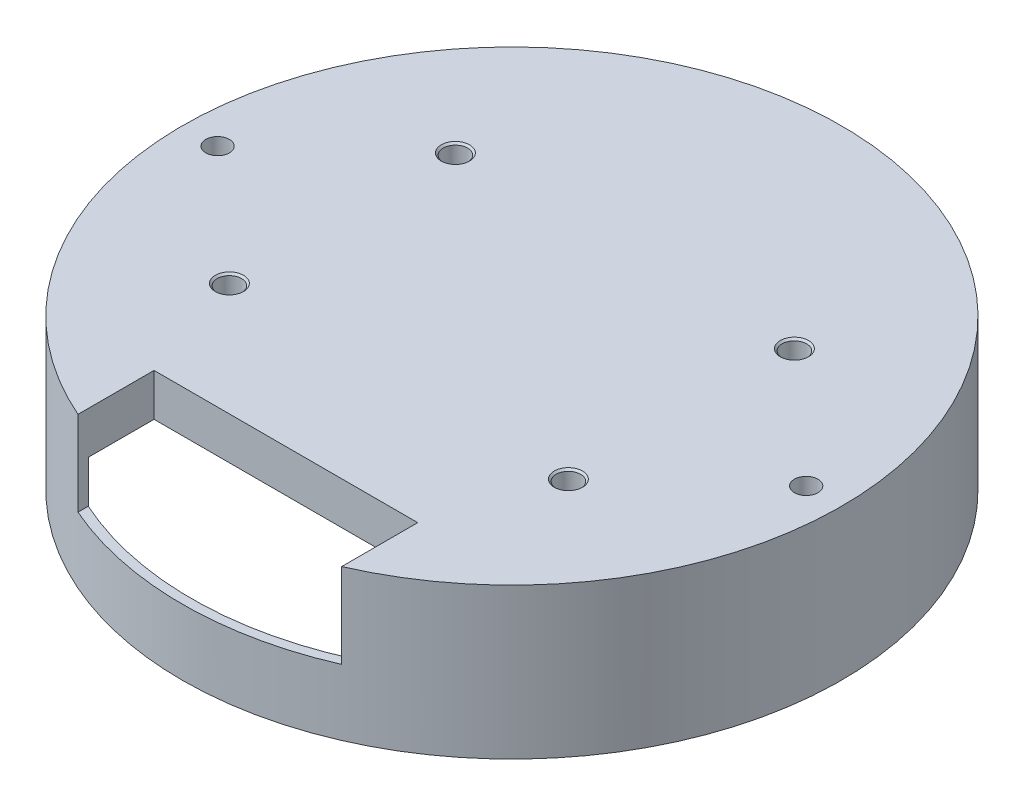
ISO-10303-21;
HEADER;
FILE_DESCRIPTION(('STEP AP214'),'2;1');
FILE_NAME('part.step','',(''),(''),'','','');
FILE_SCHEMA(('AUTOMOTIVE_DESIGN { 1 0 10303 214 1 1 1 1 }'));
ENDSEC;
DATA;
#1=APPLICATION_CONTEXT('core data for automotive mechanical design processes');
#2=APPLICATION_PROTOCOL_DEFINITION('international standard','automotive_design',2000,#1);
#3=PRODUCT_CONTEXT('',#1,'mechanical');
#4=PRODUCT('Part','Part','',(#3));
#5=PRODUCT_RELATED_PRODUCT_CATEGORY('part','',(#4));
#6=PRODUCT_DEFINITION_FORMATION('','',#4);
#7=PRODUCT_DEFINITION_CONTEXT('part definition',#1,'design');
#8=PRODUCT_DEFINITION('design','',#6,#7);
#9=PRODUCT_DEFINITION_SHAPE('','',#8);
#10=(LENGTH_UNIT() NAMED_UNIT(*) SI_UNIT(.MILLI.,.METRE.));
#11=(NAMED_UNIT(*) PLANE_ANGLE_UNIT() SI_UNIT($,.RADIAN.));
#12=(NAMED_UNIT(*) SI_UNIT($,.STERADIAN.) SOLID_ANGLE_UNIT());
#13=UNCERTAINTY_MEASURE_WITH_UNIT(LENGTH_MEASURE(1.E-05),#10,'distance_accuracy_value','');
#14=(GEOMETRIC_REPRESENTATION_CONTEXT(3) GLOBAL_UNCERTAINTY_ASSIGNED_CONTEXT((#13)) GLOBAL_UNIT_ASSIGNED_CONTEXT((#10,
#11,#12)) REPRESENTATION_CONTEXT('',''));
#15=CARTESIAN_POINT('',(0.,0.,0.));
#16=DIRECTION('',(0.,0.,1.));
#17=DIRECTION('',(1.,0.,0.));
#18=AXIS2_PLACEMENT_3D('',#15,#16,#17);
#19=CARTESIAN_POINT('',(0.,16.,0.));
#20=DIRECTION('',(0.,-1.,0.));
#21=DIRECTION('',(0.,0.,-1.));
#22=AXIS2_PLACEMENT_3D('',#19,#20,#21);
#23=CYLINDRICAL_SURFACE('',#22,35.);
#24=CARTESIAN_POINT('',(0.,7.,0.));
#25=DIRECTION('',(0.,1.,0.));
#26=DIRECTION('',(0.,0.,1.));
#27=AXIS2_PLACEMENT_3D('',#24,#25,#26);
#28=CIRCLE('',#27,35.);
#29=CARTESIAN_POINT('',(-14.,7.,32.0780298646909));
#30=VERTEX_POINT('',#29);
#31=CARTESIAN_POINT('',(14.,7.,32.0780298646909));
#32=VERTEX_POINT('',#31);
#33=EDGE_CURVE('E96',#30,#32,#28,.T.);
#34=ORIENTED_EDGE('',*,*,#33,.F.);
#35=DIRECTION('',(0.,1.,0.));
#36=VECTOR('',#35,1.);
#37=CARTESIAN_POINT('',(-14.,7.,32.0780298646909));
#38=LINE('',#37,#36);
#39=CARTESIAN_POINT('',(-14.,16.,32.0780298646909));
#40=VERTEX_POINT('',#39);
#41=EDGE_CURVE('E104',#30,#40,#38,.T.);
#42=ORIENTED_EDGE('',*,*,#41,.T.);
#43=CARTESIAN_POINT('',(0.,16.,0.));
#44=DIRECTION('',(0.,1.,0.));
#45=DIRECTION('',(0.,0.,1.));
#46=AXIS2_PLACEMENT_3D('',#43,#44,#45);
#47=CIRCLE('',#46,35.);
#48=CARTESIAN_POINT('',(14.,16.,32.0780298646909));
#49=VERTEX_POINT('',#48);
#50=EDGE_CURVE('E148',#49,#40,#47,.T.);
#51=ORIENTED_EDGE('',*,*,#50,.F.);
#52=DIRECTION('',(0.,1.,0.));
#53=VECTOR('',#52,1.);
#54=CARTESIAN_POINT('',(14.,7.,32.0780298646909));
#55=LINE('',#54,#53);
#56=EDGE_CURVE('E54',#32,#49,#55,.T.);
#57=ORIENTED_EDGE('',*,*,#56,.F.);
#58=EDGE_LOOP('',(#34,#42,#51,#57));
#59=FACE_BOUND('',#58,.T.);
#60=CARTESIAN_POINT('',(0.,0.,0.));
#61=DIRECTION('',(0.,1.,0.));
#62=DIRECTION('',(0.,0.,1.));
#63=AXIS2_PLACEMENT_3D('',#60,#61,#62);
#64=CIRCLE('',#63,35.);
#65=CARTESIAN_POINT('',(0.,0.,35.));
#66=VERTEX_POINT('',#65);
#67=EDGE_CURVE('E143',#66,#66,#64,.T.);
#68=ORIENTED_EDGE('',*,*,#67,.T.);
#69=EDGE_LOOP('',(#68));
#70=FACE_BOUND('',#69,.T.);
#71=ADVANCED_FACE('F38',(#59,#70),#23,.T.);
#72=CARTESIAN_POINT('',(0.,16.,0.));
#73=DIRECTION('',(0.,1.,0.));
#74=DIRECTION('',(0.,0.,1.));
#75=AXIS2_PLACEMENT_3D('',#72,#73,#74);
#76=PLANE('',#75);
#77=CARTESIAN_POINT('',(18.,16.,12.));
#78=DIRECTION('',(0.,1.,0.));
#79=DIRECTION('',(0.,0.,1.));
#80=AXIS2_PLACEMENT_3D('',#77,#78,#79);
#81=CIRCLE('',#80,1.5);
#82=CARTESIAN_POINT('',(18.,16.,13.5));
#83=VERTEX_POINT('',#82);
#84=EDGE_CURVE('E175',#83,#83,#81,.F.);
#85=ORIENTED_EDGE('',*,*,#84,.T.);
#86=EDGE_LOOP('',(#85));
#87=FACE_BOUND('',#86,.T.);
#88=CARTESIAN_POINT('',(-18.,16.,12.));
#89=DIRECTION('',(0.,1.,0.));
#90=DIRECTION('',(0.,0.,1.));
#91=AXIS2_PLACEMENT_3D('',#88,#89,#90);
#92=CIRCLE('',#91,1.5);
#93=CARTESIAN_POINT('',(-18.,16.,13.5));
#94=VERTEX_POINT('',#93);
#95=EDGE_CURVE('E172',#94,#94,#92,.F.);
#96=ORIENTED_EDGE('',*,*,#95,.T.);
#97=EDGE_LOOP('',(#96));
#98=FACE_BOUND('',#97,.T.);
#99=CARTESIAN_POINT('',(18.,16.,-12.));
#100=DIRECTION('',(0.,1.,0.));
#101=DIRECTION('',(0.,0.,1.));
#102=AXIS2_PLACEMENT_3D('',#99,#100,#101);
#103=CIRCLE('',#102,1.5);
#104=CARTESIAN_POINT('',(18.,16.,-10.5));
#105=VERTEX_POINT('',#104);
#106=EDGE_CURVE('E169',#105,#105,#103,.F.);
#107=ORIENTED_EDGE('',*,*,#106,.T.);
#108=EDGE_LOOP('',(#107));
#109=FACE_BOUND('',#108,.T.);
#110=CARTESIAN_POINT('',(-18.,16.,-12.));
#111=DIRECTION('',(0.,1.,0.));
#112=DIRECTION('',(0.,0.,1.));
#113=AXIS2_PLACEMENT_3D('',#110,#111,#112);
#114=CIRCLE('',#113,1.5);
#115=CARTESIAN_POINT('',(-18.,16.,-10.5));
#116=VERTEX_POINT('',#115);
#117=EDGE_CURVE('E166',#116,#116,#114,.F.);
#118=ORIENTED_EDGE('',*,*,#117,.T.);
#119=EDGE_LOOP('',(#118));
#120=FACE_BOUND('',#119,.T.);
#121=DIRECTION('',(0.,0.,1.));
#122=VECTOR('',#121,1.);
#123=CARTESIAN_POINT('',(-14.,16.,24.));
#124=LINE('',#123,#122);
#125=CARTESIAN_POINT('',(-14.,16.,24.));
#126=VERTEX_POINT('',#125);
#127=EDGE_CURVE('E107',#126,#40,#124,.T.);
#128=ORIENTED_EDGE('',*,*,#127,.F.);
#129=DIRECTION('',(-1.,0.,0.));
#130=VECTOR('',#129,1.);
#131=CARTESIAN_POINT('',(-14.,16.,24.));
#132=LINE('',#131,#130);
#133=CARTESIAN_POINT('',(14.,16.,24.));
#134=VERTEX_POINT('',#133);
#135=EDGE_CURVE('E101',#134,#126,#132,.T.);
#136=ORIENTED_EDGE('',*,*,#135,.F.);
#137=DIRECTION('',(0.,0.,-1.));
#138=VECTOR('',#137,1.);
#139=CARTESIAN_POINT('',(14.,16.,24.));
#140=LINE('',#139,#138);
#141=EDGE_CURVE('E119',#49,#134,#140,.T.);
#142=ORIENTED_EDGE('',*,*,#141,.F.);
#143=ORIENTED_EDGE('',*,*,#50,.T.);
#144=EDGE_LOOP('',(#128,#136,#142,#143));
#145=FACE_BOUND('',#144,.T.);
#146=CARTESIAN_POINT('',(-31.25,16.,0.));
#147=DIRECTION('',(0.,1.,0.));
#148=DIRECTION('',(0.,0.,1.));
#149=AXIS2_PLACEMENT_3D('',#146,#147,#148);
#150=CIRCLE('',#149,1.25);
#151=CARTESIAN_POINT('',(-31.25,16.,1.25));
#152=VERTEX_POINT('',#151);
#153=EDGE_CURVE('E134',#152,#152,#150,.T.);
#154=ORIENTED_EDGE('',*,*,#153,.F.);
#155=EDGE_LOOP('',(#154));
#156=FACE_BOUND('',#155,.T.);
#157=CARTESIAN_POINT('',(31.25,16.,0.));
#158=DIRECTION('',(0.,1.,0.));
#159=DIRECTION('',(0.,0.,1.));
#160=AXIS2_PLACEMENT_3D('',#157,#158,#159);
#161=CIRCLE('',#160,1.25);
#162=CARTESIAN_POINT('',(31.25,16.,1.25));
#163=VERTEX_POINT('',#162);
#164=EDGE_CURVE('E133',#163,#163,#161,.T.);
#165=ORIENTED_EDGE('',*,*,#164,.F.);
#166=EDGE_LOOP('',(#165));
#167=FACE_BOUND('',#166,.T.);
#168=ADVANCED_FACE('F201',(#87,#98,#109,#120,#145,#156,#167),#76,.T.);
#169=CARTESIAN_POINT('',(0.,0.,0.));
#170=DIRECTION('',(0.,1.,0.));
#171=DIRECTION('',(0.,0.,1.));
#172=AXIS2_PLACEMENT_3D('',#169,#170,#171);
#173=PLANE('',#172);
#174=CARTESIAN_POINT('',(0.,0.,0.));
#175=DIRECTION('',(0.,-1.,0.));
#176=DIRECTION('',(0.,0.,-1.));
#177=AXIS2_PLACEMENT_3D('',#174,#175,#176);
#178=CIRCLE('',#177,34.);
#179=CARTESIAN_POINT('',(0.,0.,-34.));
#180=VERTEX_POINT('',#179);
#181=EDGE_CURVE('E144',#180,#180,#178,.T.);
#182=ORIENTED_EDGE('',*,*,#181,.F.);
#183=EDGE_LOOP('',(#182));
#184=FACE_BOUND('',#183,.T.);
#185=ORIENTED_EDGE('',*,*,#67,.F.);
#186=EDGE_LOOP('',(#185));
#187=FACE_BOUND('',#186,.T.);
#188=ADVANCED_FACE('F206',(#184,#187),#173,.F.);
#189=CARTESIAN_POINT('',(0.,11.5,0.));
#190=DIRECTION('',(0.,-1.,0.));
#191=DIRECTION('',(0.,0.,-1.));
#192=AXIS2_PLACEMENT_3D('',#189,#190,#191);
#193=CYLINDRICAL_SURFACE('',#192,34.);
#194=CARTESIAN_POINT('',(0.,11.5,0.));
#195=DIRECTION('',(0.,-1.,0.));
#196=DIRECTION('',(0.,0.,-1.));
#197=AXIS2_PLACEMENT_3D('',#194,#195,#196);
#198=CIRCLE('',#197,34.);
#199=CARTESIAN_POINT('',(-14.,11.5,30.9838667696593));
#200=VERTEX_POINT('',#199);
#201=CARTESIAN_POINT('',(14.,11.5,30.9838667696593));
#202=VERTEX_POINT('',#201);
#203=EDGE_CURVE('E140',#200,#202,#198,.T.);
#204=ORIENTED_EDGE('',*,*,#203,.F.);
#205=DIRECTION('',(0.,-1.,0.));
#206=VECTOR('',#205,1.);
#207=CARTESIAN_POINT('',(-14.,11.5,30.9838667696593));
#208=LINE('',#207,#206);
#209=CARTESIAN_POINT('',(-14.,7.,30.9838667696593));
#210=VERTEX_POINT('',#209);
#211=EDGE_CURVE('E131',#200,#210,#208,.T.);
#212=ORIENTED_EDGE('',*,*,#211,.T.);
#213=CARTESIAN_POINT('',(0.,7.,0.));
#214=DIRECTION('',(0.,1.,0.));
#215=DIRECTION('',(0.,0.,1.));
#216=AXIS2_PLACEMENT_3D('',#213,#214,#215);
#217=CIRCLE('',#216,34.);
#218=CARTESIAN_POINT('',(14.,7.,30.9838667696593));
#219=VERTEX_POINT('',#218);
#220=EDGE_CURVE('E98',#219,#210,#217,.F.);
#221=ORIENTED_EDGE('',*,*,#220,.F.);
#222=DIRECTION('',(0.,-1.,0.));
#223=VECTOR('',#222,1.);
#224=CARTESIAN_POINT('',(14.,11.5,30.9838667696593));
#225=LINE('',#224,#223);
#226=EDGE_CURVE('E126',#219,#202,#225,.F.);
#227=ORIENTED_EDGE('',*,*,#226,.T.);
#228=EDGE_LOOP('',(#204,#212,#221,#227));
#229=FACE_BOUND('',#228,.T.);
#230=ORIENTED_EDGE('',*,*,#181,.T.);
#231=EDGE_LOOP('',(#230));
#232=FACE_BOUND('',#231,.T.);
#233=ADVANCED_FACE('F288',(#229,#232),#193,.F.);
#234=CARTESIAN_POINT('',(0.,11.5,0.));
#235=DIRECTION('',(0.,-1.,0.));
#236=DIRECTION('',(0.,0.,-1.));
#237=AXIS2_PLACEMENT_3D('',#234,#235,#236);
#238=PLANE('',#237);
#239=DIRECTION('',(0.,0.,-1.));
#240=VECTOR('',#239,1.);
#241=CARTESIAN_POINT('',(-14.,11.5,0.));
#242=LINE('',#241,#240);
#243=CARTESIAN_POINT('',(-14.,11.5,24.));
#244=VERTEX_POINT('',#243);
#245=EDGE_CURVE('E160',#200,#244,#242,.T.);
#246=ORIENTED_EDGE('',*,*,#245,.F.);
#247=ORIENTED_EDGE('',*,*,#203,.T.);
#248=DIRECTION('',(0.,0.,1.));
#249=VECTOR('',#248,1.);
#250=CARTESIAN_POINT('',(14.,11.5,0.));
#251=LINE('',#250,#249);
#252=CARTESIAN_POINT('',(14.,11.5,24.));
#253=VERTEX_POINT('',#252);
#254=EDGE_CURVE('E150',#253,#202,#251,.T.);
#255=ORIENTED_EDGE('',*,*,#254,.F.);
#256=DIRECTION('',(1.,0.,0.));
#257=VECTOR('',#256,1.);
#258=CARTESIAN_POINT('',(0.,11.5,24.));
#259=LINE('',#258,#257);
#260=EDGE_CURVE('E158',#244,#253,#259,.T.);
#261=ORIENTED_EDGE('',*,*,#260,.F.);
#262=EDGE_LOOP('',(#246,#247,#255,#261));
#263=FACE_BOUND('',#262,.T.);
#264=CARTESIAN_POINT('',(-31.25,11.5,0.));
#265=DIRECTION('',(0.,-1.,0.));
#266=DIRECTION('',(0.,0.,-1.));
#267=AXIS2_PLACEMENT_3D('',#264,#265,#266);
#268=CIRCLE('',#267,1.25);
#269=CARTESIAN_POINT('',(-31.25,11.5,-1.25));
#270=VERTEX_POINT('',#269);
#271=EDGE_CURVE('E147',#270,#270,#268,.F.);
#272=ORIENTED_EDGE('',*,*,#271,.T.);
#273=EDGE_LOOP('',(#272));
#274=FACE_BOUND('',#273,.T.);
#275=CARTESIAN_POINT('',(31.25,11.5,0.));
#276=DIRECTION('',(0.,-1.,0.));
#277=DIRECTION('',(0.,0.,-1.));
#278=AXIS2_PLACEMENT_3D('',#275,#276,#277);
#279=CIRCLE('',#278,1.25);
#280=CARTESIAN_POINT('',(31.25,11.5,-1.25));
#281=VERTEX_POINT('',#280);
#282=EDGE_CURVE('E137',#281,#281,#279,.F.);
#283=ORIENTED_EDGE('',*,*,#282,.T.);
#284=EDGE_LOOP('',(#283));
#285=FACE_BOUND('',#284,.T.);
#286=ADVANCED_FACE('F284',(#263,#274,#285),#238,.T.);
#287=CARTESIAN_POINT('',(31.25,19.5355339059327,0.));
#288=DIRECTION('',(0.,-1.,0.));
#289=DIRECTION('',(0.,0.,-1.));
#290=AXIS2_PLACEMENT_3D('',#287,#288,#289);
#291=CYLINDRICAL_SURFACE('',#290,1.25);
#292=ORIENTED_EDGE('',*,*,#282,.F.);
#293=EDGE_LOOP('',(#292));
#294=FACE_BOUND('',#293,.T.);
#295=ORIENTED_EDGE('',*,*,#164,.T.);
#296=EDGE_LOOP('',(#295));
#297=FACE_BOUND('',#296,.T.);
#298=ADVANCED_FACE('F280',(#294,#297),#291,.F.);
#299=CARTESIAN_POINT('',(-31.25,19.5355339059327,0.));
#300=DIRECTION('',(0.,-1.,0.));
#301=DIRECTION('',(0.,0.,-1.));
#302=AXIS2_PLACEMENT_3D('',#299,#300,#301);
#303=CYLINDRICAL_SURFACE('',#302,1.25);
#304=ORIENTED_EDGE('',*,*,#271,.F.);
#305=EDGE_LOOP('',(#304));
#306=FACE_BOUND('',#305,.T.);
#307=ORIENTED_EDGE('',*,*,#153,.T.);
#308=EDGE_LOOP('',(#307));
#309=FACE_BOUND('',#308,.T.);
#310=ADVANCED_FACE('F272',(#306,#309),#303,.F.);
#311=CARTESIAN_POINT('',(0.,7.,0.));
#312=DIRECTION('',(0.,1.,0.));
#313=DIRECTION('',(0.,0.,1.));
#314=AXIS2_PLACEMENT_3D('',#311,#312,#313);
#315=PLANE('',#314);
#316=ORIENTED_EDGE('',*,*,#220,.T.);
#317=DIRECTION('',(0.,0.,1.));
#318=VECTOR('',#317,1.);
#319=CARTESIAN_POINT('',(-14.,7.,24.));
#320=LINE('',#319,#318);
#321=EDGE_CURVE('E91',#210,#30,#320,.T.);
#322=ORIENTED_EDGE('',*,*,#321,.T.);
#323=ORIENTED_EDGE('',*,*,#33,.T.);
#324=DIRECTION('',(0.,0.,-1.));
#325=VECTOR('',#324,1.);
#326=CARTESIAN_POINT('',(14.,7.,24.));
#327=LINE('',#326,#325);
#328=EDGE_CURVE('E111',#32,#219,#327,.T.);
#329=ORIENTED_EDGE('',*,*,#328,.T.);
#330=EDGE_LOOP('',(#316,#322,#323,#329));
#331=FACE_BOUND('',#330,.T.);
#332=ADVANCED_FACE('F93',(#331),#315,.T.);
#333=CARTESIAN_POINT('',(-14.,7.,24.));
#334=DIRECTION('',(-1.,0.,0.));
#335=DIRECTION('',(0.,0.,1.));
#336=AXIS2_PLACEMENT_3D('',#333,#334,#335);
#337=PLANE('',#336);
#338=ORIENTED_EDGE('',*,*,#245,.T.);
#339=DIRECTION('',(0.,1.,0.));
#340=VECTOR('',#339,1.);
#341=CARTESIAN_POINT('',(-14.,7.,24.));
#342=LINE('',#341,#340);
#343=EDGE_CURVE('E124',#244,#126,#342,.T.);
#344=ORIENTED_EDGE('',*,*,#343,.T.);
#345=ORIENTED_EDGE('',*,*,#127,.T.);
#346=ORIENTED_EDGE('',*,*,#41,.F.);
#347=ORIENTED_EDGE('',*,*,#321,.F.);
#348=ORIENTED_EDGE('',*,*,#211,.F.);
#349=EDGE_LOOP('',(#338,#344,#345,#346,#347,#348));
#350=FACE_BOUND('',#349,.T.);
#351=ADVANCED_FACE('F105',(#350),#337,.F.);
#352=CARTESIAN_POINT('',(14.,7.,24.));
#353=DIRECTION('',(1.,0.,0.));
#354=DIRECTION('',(0.,0.,-1.));
#355=AXIS2_PLACEMENT_3D('',#352,#353,#354);
#356=PLANE('',#355);
#357=ORIENTED_EDGE('',*,*,#328,.F.);
#358=ORIENTED_EDGE('',*,*,#56,.T.);
#359=ORIENTED_EDGE('',*,*,#141,.T.);
#360=DIRECTION('',(0.,1.,0.));
#361=VECTOR('',#360,1.);
#362=CARTESIAN_POINT('',(14.,7.,24.));
#363=LINE('',#362,#361);
#364=EDGE_CURVE('E60',#253,#134,#363,.T.);
#365=ORIENTED_EDGE('',*,*,#364,.F.);
#366=ORIENTED_EDGE('',*,*,#254,.T.);
#367=ORIENTED_EDGE('',*,*,#226,.F.);
#368=EDGE_LOOP('',(#357,#358,#359,#365,#366,#367));
#369=FACE_BOUND('',#368,.T.);
#370=ADVANCED_FACE('F266',(#369),#356,.F.);
#371=CARTESIAN_POINT('',(-14.,7.,24.));
#372=DIRECTION('',(0.,0.,-1.));
#373=DIRECTION('',(-1.,0.,0.));
#374=AXIS2_PLACEMENT_3D('',#371,#372,#373);
#375=PLANE('',#374);
#376=ORIENTED_EDGE('',*,*,#260,.T.);
#377=ORIENTED_EDGE('',*,*,#364,.T.);
#378=ORIENTED_EDGE('',*,*,#135,.T.);
#379=ORIENTED_EDGE('',*,*,#343,.F.);
#380=EDGE_LOOP('',(#376,#377,#378,#379));
#381=FACE_BOUND('',#380,.T.);
#382=ADVANCED_FACE('F258',(#381),#375,.F.);
#383=CARTESIAN_POINT('',(-18.,13.5,-12.));
#384=DIRECTION('',(0.,1.,0.));
#385=DIRECTION('',(0.,0.,1.));
#386=AXIS2_PLACEMENT_3D('',#383,#384,#385);
#387=CYLINDRICAL_SURFACE('',#386,1.3);
#388=CARTESIAN_POINT('',(-18.,15.8,-12.));
#389=DIRECTION('',(0.,1.,0.));
#390=DIRECTION('',(0.,0.,1.));
#391=AXIS2_PLACEMENT_3D('',#388,#389,#390);
#392=CIRCLE('',#391,1.3);
#393=CARTESIAN_POINT('',(-18.,15.8,-10.7));
#394=VERTEX_POINT('',#393);
#395=EDGE_CURVE('E11',#394,#394,#392,.T.);
#396=ORIENTED_EDGE('',*,*,#395,.T.);
#397=EDGE_LOOP('',(#396));
#398=FACE_BOUND('',#397,.T.);
#399=CARTESIAN_POINT('',(-18.,13.5,-12.));
#400=DIRECTION('',(0.,1.,0.));
#401=DIRECTION('',(0.,0.,1.));
#402=AXIS2_PLACEMENT_3D('',#399,#400,#401);
#403=CIRCLE('',#402,1.3);
#404=CARTESIAN_POINT('',(-18.,13.5,-10.7));
#405=VERTEX_POINT('',#404);
#406=EDGE_CURVE('E120',#405,#405,#403,.T.);
#407=ORIENTED_EDGE('',*,*,#406,.F.);
#408=EDGE_LOOP('',(#407));
#409=FACE_BOUND('',#408,.T.);
#410=ADVANCED_FACE('F256',(#398,#409),#387,.F.);
#411=CARTESIAN_POINT('',(-18.,13.5,-12.));
#412=DIRECTION('',(0.,1.,0.));
#413=DIRECTION('',(0.,0.,1.));
#414=AXIS2_PLACEMENT_3D('',#411,#412,#413);
#415=PLANE('',#414);
#416=ORIENTED_EDGE('',*,*,#406,.T.);
#417=EDGE_LOOP('',(#416));
#418=FACE_BOUND('',#417,.T.);
#419=ADVANCED_FACE('F254',(#418),#415,.T.);
#420=CARTESIAN_POINT('',(18.,13.5,-12.));
#421=DIRECTION('',(0.,1.,0.));
#422=DIRECTION('',(0.,0.,1.));
#423=AXIS2_PLACEMENT_3D('',#420,#421,#422);
#424=CYLINDRICAL_SURFACE('',#423,1.3);
#425=CARTESIAN_POINT('',(18.,15.8,-12.));
#426=DIRECTION('',(0.,1.,0.));
#427=DIRECTION('',(0.,0.,1.));
#428=AXIS2_PLACEMENT_3D('',#425,#426,#427);
#429=CIRCLE('',#428,1.3);
#430=CARTESIAN_POINT('',(18.,15.8,-10.7));
#431=VERTEX_POINT('',#430);
#432=EDGE_CURVE('E47',#431,#431,#429,.T.);
#433=ORIENTED_EDGE('',*,*,#432,.T.);
#434=EDGE_LOOP('',(#433));
#435=FACE_BOUND('',#434,.T.);
#436=CARTESIAN_POINT('',(18.,13.5,-12.));
#437=DIRECTION('',(0.,1.,0.));
#438=DIRECTION('',(0.,0.,1.));
#439=AXIS2_PLACEMENT_3D('',#436,#437,#438);
#440=CIRCLE('',#439,1.3);
#441=CARTESIAN_POINT('',(18.,13.5,-10.7));
#442=VERTEX_POINT('',#441);
#443=EDGE_CURVE('E244',#442,#442,#440,.T.);
#444=ORIENTED_EDGE('',*,*,#443,.F.);
#445=EDGE_LOOP('',(#444));
#446=FACE_BOUND('',#445,.T.);
#447=ADVANCED_FACE('F183',(#435,#446),#424,.F.);
#448=CARTESIAN_POINT('',(18.,13.5,-12.));
#449=DIRECTION('',(0.,1.,0.));
#450=DIRECTION('',(0.,0.,1.));
#451=AXIS2_PLACEMENT_3D('',#448,#449,#450);
#452=PLANE('',#451);
#453=ORIENTED_EDGE('',*,*,#443,.T.);
#454=EDGE_LOOP('',(#453));
#455=FACE_BOUND('',#454,.T.);
#456=ADVANCED_FACE('F238',(#455),#452,.T.);
#457=CARTESIAN_POINT('',(18.,13.5,12.));
#458=DIRECTION('',(0.,1.,0.));
#459=DIRECTION('',(0.,0.,1.));
#460=AXIS2_PLACEMENT_3D('',#457,#458,#459);
#461=CYLINDRICAL_SURFACE('',#460,1.3);
#462=CARTESIAN_POINT('',(18.,15.8,12.));
#463=DIRECTION('',(0.,1.,0.));
#464=DIRECTION('',(0.,0.,1.));
#465=AXIS2_PLACEMENT_3D('',#462,#463,#464);
#466=CIRCLE('',#465,1.3);
#467=CARTESIAN_POINT('',(18.,15.8,13.3));
#468=VERTEX_POINT('',#467);
#469=EDGE_CURVE('E163',#468,#468,#466,.T.);
#470=ORIENTED_EDGE('',*,*,#469,.T.);
#471=EDGE_LOOP('',(#470));
#472=FACE_BOUND('',#471,.T.);
#473=CARTESIAN_POINT('',(18.,13.5,12.));
#474=DIRECTION('',(0.,1.,0.));
#475=DIRECTION('',(0.,0.,1.));
#476=AXIS2_PLACEMENT_3D('',#473,#474,#475);
#477=CIRCLE('',#476,1.3);
#478=CARTESIAN_POINT('',(18.,13.5,13.3));
#479=VERTEX_POINT('',#478);
#480=EDGE_CURVE('E242',#479,#479,#477,.T.);
#481=ORIENTED_EDGE('',*,*,#480,.F.);
#482=EDGE_LOOP('',(#481));
#483=FACE_BOUND('',#482,.T.);
#484=ADVANCED_FACE('F234',(#472,#483),#461,.F.);
#485=CARTESIAN_POINT('',(18.,13.5,12.));
#486=DIRECTION('',(0.,1.,0.));
#487=DIRECTION('',(0.,0.,1.));
#488=AXIS2_PLACEMENT_3D('',#485,#486,#487);
#489=PLANE('',#488);
#490=ORIENTED_EDGE('',*,*,#480,.T.);
#491=EDGE_LOOP('',(#490));
#492=FACE_BOUND('',#491,.T.);
#493=ADVANCED_FACE('F237',(#492),#489,.T.);
#494=CARTESIAN_POINT('',(-18.,13.5,12.));
#495=DIRECTION('',(0.,1.,0.));
#496=DIRECTION('',(0.,0.,1.));
#497=AXIS2_PLACEMENT_3D('',#494,#495,#496);
#498=CYLINDRICAL_SURFACE('',#497,1.3);
#499=CARTESIAN_POINT('',(-18.,15.8,12.));
#500=DIRECTION('',(0.,1.,0.));
#501=DIRECTION('',(0.,0.,1.));
#502=AXIS2_PLACEMENT_3D('',#499,#500,#501);
#503=CIRCLE('',#502,1.3);
#504=CARTESIAN_POINT('',(-18.,15.8,13.3));
#505=VERTEX_POINT('',#504);
#506=EDGE_CURVE('E178',#505,#505,#503,.T.);
#507=ORIENTED_EDGE('',*,*,#506,.T.);
#508=EDGE_LOOP('',(#507));
#509=FACE_BOUND('',#508,.T.);
#510=CARTESIAN_POINT('',(-18.,13.5,12.));
#511=DIRECTION('',(0.,1.,0.));
#512=DIRECTION('',(0.,0.,1.));
#513=AXIS2_PLACEMENT_3D('',#510,#511,#512);
#514=CIRCLE('',#513,1.3);
#515=CARTESIAN_POINT('',(-18.,13.5,13.3));
#516=VERTEX_POINT('',#515);
#517=EDGE_CURVE('E245',#516,#516,#514,.T.);
#518=ORIENTED_EDGE('',*,*,#517,.F.);
#519=EDGE_LOOP('',(#518));
#520=FACE_BOUND('',#519,.T.);
#521=ADVANCED_FACE('F227',(#509,#520),#498,.F.);
#522=CARTESIAN_POINT('',(-18.,13.5,12.));
#523=DIRECTION('',(0.,1.,0.));
#524=DIRECTION('',(0.,0.,1.));
#525=AXIS2_PLACEMENT_3D('',#522,#523,#524);
#526=PLANE('',#525);
#527=ORIENTED_EDGE('',*,*,#517,.T.);
#528=EDGE_LOOP('',(#527));
#529=FACE_BOUND('',#528,.T.);
#530=ADVANCED_FACE('F216',(#529),#526,.T.);
#531=CARTESIAN_POINT('',(18.,15.8,12.));
#532=DIRECTION('',(0.,1.,0.));
#533=DIRECTION('',(0.,0.,1.));
#534=AXIS2_PLACEMENT_3D('',#531,#532,#533);
#535=CONICAL_SURFACE('',#534,1.3,0.785398163397451);
#536=ORIENTED_EDGE('',*,*,#84,.F.);
#537=EDGE_LOOP('',(#536));
#538=FACE_BOUND('',#537,.T.);
#539=ORIENTED_EDGE('',*,*,#469,.F.);
#540=EDGE_LOOP('',(#539));
#541=FACE_BOUND('',#540,.T.);
#542=ADVANCED_FACE('F195',(#538,#541),#535,.F.);
#543=CARTESIAN_POINT('',(-18.,15.8,12.));
#544=DIRECTION('',(0.,1.,0.));
#545=DIRECTION('',(0.,0.,1.));
#546=AXIS2_PLACEMENT_3D('',#543,#544,#545);
#547=CONICAL_SURFACE('',#546,1.3,0.785398163397451);
#548=ORIENTED_EDGE('',*,*,#95,.F.);
#549=EDGE_LOOP('',(#548));
#550=FACE_BOUND('',#549,.T.);
#551=ORIENTED_EDGE('',*,*,#506,.F.);
#552=EDGE_LOOP('',(#551));
#553=FACE_BOUND('',#552,.T.);
#554=ADVANCED_FACE('F188',(#550,#553),#547,.F.);
#555=CARTESIAN_POINT('',(18.,15.8,-12.));
#556=DIRECTION('',(0.,1.,0.));
#557=DIRECTION('',(0.,0.,1.));
#558=AXIS2_PLACEMENT_3D('',#555,#556,#557);
#559=CONICAL_SURFACE('',#558,1.3,0.785398163397451);
#560=ORIENTED_EDGE('',*,*,#106,.F.);
#561=EDGE_LOOP('',(#560));
#562=FACE_BOUND('',#561,.T.);
#563=ORIENTED_EDGE('',*,*,#432,.F.);
#564=EDGE_LOOP('',(#563));
#565=FACE_BOUND('',#564,.T.);
#566=ADVANCED_FACE('F186',(#562,#565),#559,.F.);
#567=CARTESIAN_POINT('',(-18.,15.8,-12.));
#568=DIRECTION('',(0.,1.,0.));
#569=DIRECTION('',(0.,0.,1.));
#570=AXIS2_PLACEMENT_3D('',#567,#568,#569);
#571=CONICAL_SURFACE('',#570,1.3,0.785398163397451);
#572=ORIENTED_EDGE('',*,*,#117,.F.);
#573=EDGE_LOOP('',(#572));
#574=FACE_BOUND('',#573,.T.);
#575=ORIENTED_EDGE('',*,*,#395,.F.);
#576=EDGE_LOOP('',(#575));
#577=FACE_BOUND('',#576,.T.);
#578=ADVANCED_FACE('F41',(#574,#577),#571,.F.);
#579=CLOSED_SHELL('',(#71,#168,#188,#233,#286,#298,#310,#332,#351,#370,#382,#410,#419,#447,#456,
#484,#493,#521,#530,#542,#554,#566,#578));
#580=MANIFOLD_SOLID_BREP('B2',#579);
#581=ADVANCED_BREP_SHAPE_REPRESENTATION('',(#18,#580),#14);
#582=SHAPE_DEFINITION_REPRESENTATION(#9,#581);
ENDSEC;
END-ISO-10303-21;
